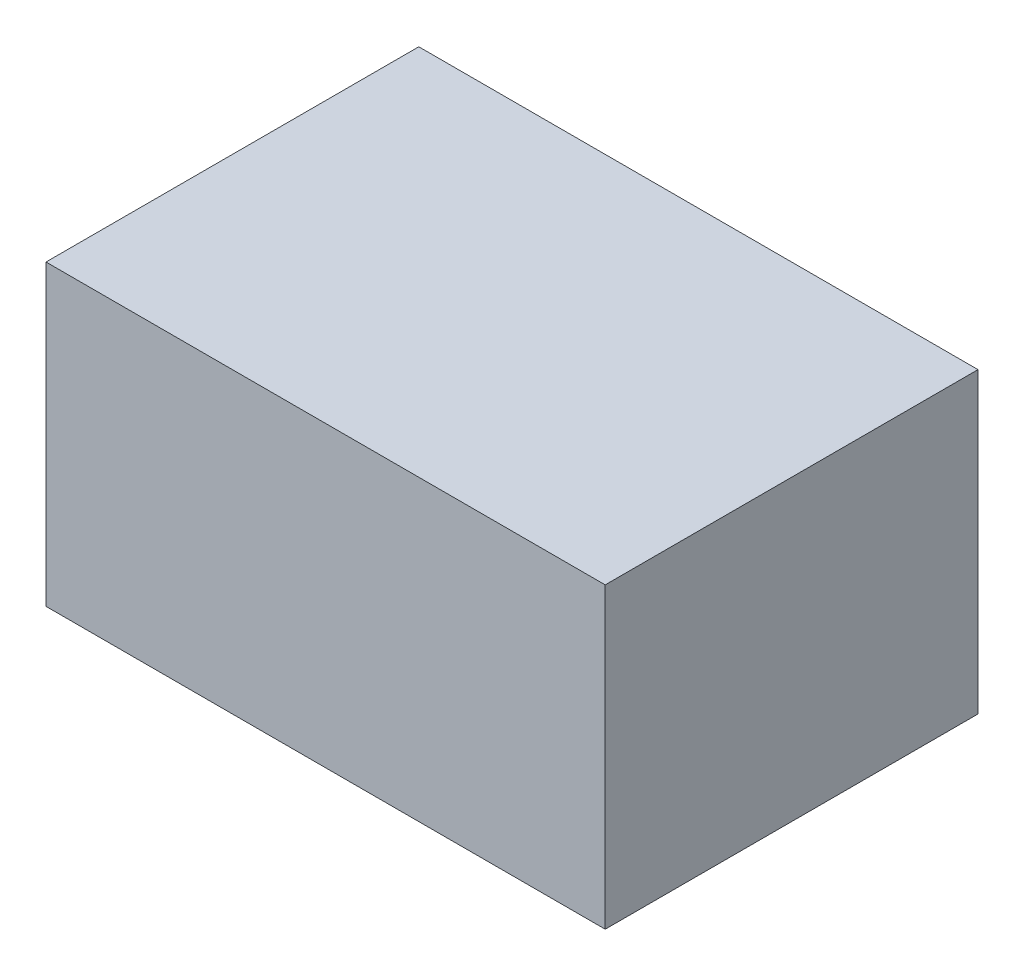
ISO-10303-21;
HEADER;
FILE_DESCRIPTION(('STEP AP214'),'2;1');
FILE_NAME('part.step','',(''),(''),'','','');
FILE_SCHEMA(('AUTOMOTIVE_DESIGN { 1 0 10303 214 1 1 1 1 }'));
ENDSEC;
DATA;
#1=APPLICATION_CONTEXT('core data for automotive mechanical design processes');
#2=APPLICATION_PROTOCOL_DEFINITION('international standard','automotive_design',2000,#1);
#3=PRODUCT_CONTEXT('',#1,'mechanical');
#4=PRODUCT('Part','Part','',(#3));
#5=PRODUCT_RELATED_PRODUCT_CATEGORY('part','',(#4));
#6=PRODUCT_DEFINITION_FORMATION('','',#4);
#7=PRODUCT_DEFINITION_CONTEXT('part definition',#1,'design');
#8=PRODUCT_DEFINITION('design','',#6,#7);
#9=PRODUCT_DEFINITION_SHAPE('','',#8);
#10=(LENGTH_UNIT() NAMED_UNIT(*) SI_UNIT(.MILLI.,.METRE.));
#11=(NAMED_UNIT(*) PLANE_ANGLE_UNIT() SI_UNIT($,.RADIAN.));
#12=(NAMED_UNIT(*) SI_UNIT($,.STERADIAN.) SOLID_ANGLE_UNIT());
#13=UNCERTAINTY_MEASURE_WITH_UNIT(LENGTH_MEASURE(1.E-05),#10,'distance_accuracy_value','');
#14=(GEOMETRIC_REPRESENTATION_CONTEXT(3) GLOBAL_UNCERTAINTY_ASSIGNED_CONTEXT((#13)) GLOBAL_UNIT_ASSIGNED_CONTEXT((#10,
#11,#12)) REPRESENTATION_CONTEXT('',''));
#15=CARTESIAN_POINT('',(0.,0.,0.));
#16=DIRECTION('',(0.,0.,1.));
#17=DIRECTION('',(1.,0.,0.));
#18=AXIS2_PLACEMENT_3D('',#15,#16,#17);
#19=CARTESIAN_POINT('',(-75.,80.,-50.));
#20=DIRECTION('',(1.,0.,0.));
#21=DIRECTION('',(0.,0.,-1.));
#22=AXIS2_PLACEMENT_3D('',#19,#20,#21);
#23=PLANE('',#22);
#24=DIRECTION('',(0.,0.,1.));
#25=VECTOR('',#24,1.);
#26=CARTESIAN_POINT('',(-75.,0.,-50.));
#27=LINE('',#26,#25);
#28=CARTESIAN_POINT('',(-75.,0.,-50.));
#29=VERTEX_POINT('',#28);
#30=CARTESIAN_POINT('',(-75.,0.,50.));
#31=VERTEX_POINT('',#30);
#32=EDGE_CURVE('E98',#29,#31,#27,.T.);
#33=ORIENTED_EDGE('',*,*,#32,.T.);
#34=DIRECTION('',(0.,-1.,0.));
#35=VECTOR('',#34,1.);
#36=CARTESIAN_POINT('',(-75.,80.,50.));
#37=LINE('',#36,#35);
#38=CARTESIAN_POINT('',(-75.,80.,50.));
#39=VERTEX_POINT('',#38);
#40=EDGE_CURVE('E11',#39,#31,#37,.T.);
#41=ORIENTED_EDGE('',*,*,#40,.F.);
#42=DIRECTION('',(0.,0.,1.));
#43=VECTOR('',#42,1.);
#44=CARTESIAN_POINT('',(-75.,80.,-50.));
#45=LINE('',#44,#43);
#46=CARTESIAN_POINT('',(-75.,80.,-50.));
#47=VERTEX_POINT('',#46);
#48=EDGE_CURVE('E86',#47,#39,#45,.T.);
#49=ORIENTED_EDGE('',*,*,#48,.F.);
#50=DIRECTION('',(0.,-1.,0.));
#51=VECTOR('',#50,1.);
#52=CARTESIAN_POINT('',(-75.,80.,-50.));
#53=LINE('',#52,#51);
#54=EDGE_CURVE('E94',#47,#29,#53,.T.);
#55=ORIENTED_EDGE('',*,*,#54,.T.);
#56=EDGE_LOOP('',(#33,#41,#49,#55));
#57=FACE_BOUND('',#56,.T.);
#58=ADVANCED_FACE('F35',(#57),#23,.F.);
#59=CARTESIAN_POINT('',(-75.,80.,50.));
#60=DIRECTION('',(0.,0.,-1.));
#61=DIRECTION('',(-1.,0.,0.));
#62=AXIS2_PLACEMENT_3D('',#59,#60,#61);
#63=PLANE('',#62);
#64=DIRECTION('',(1.,0.,0.));
#65=VECTOR('',#64,1.);
#66=CARTESIAN_POINT('',(-75.,0.,50.));
#67=LINE('',#66,#65);
#68=CARTESIAN_POINT('',(75.,0.,50.));
#69=VERTEX_POINT('',#68);
#70=EDGE_CURVE('E90',#31,#69,#67,.T.);
#71=ORIENTED_EDGE('',*,*,#70,.T.);
#72=DIRECTION('',(0.,-1.,0.));
#73=VECTOR('',#72,1.);
#74=CARTESIAN_POINT('',(75.,80.,50.));
#75=LINE('',#74,#73);
#76=CARTESIAN_POINT('',(75.,80.,50.));
#77=VERTEX_POINT('',#76);
#78=EDGE_CURVE('E43',#77,#69,#75,.T.);
#79=ORIENTED_EDGE('',*,*,#78,.F.);
#80=DIRECTION('',(1.,0.,0.));
#81=VECTOR('',#80,1.);
#82=CARTESIAN_POINT('',(-75.,80.,50.));
#83=LINE('',#82,#81);
#84=EDGE_CURVE('E81',#39,#77,#83,.T.);
#85=ORIENTED_EDGE('',*,*,#84,.F.);
#86=ORIENTED_EDGE('',*,*,#40,.T.);
#87=EDGE_LOOP('',(#71,#79,#85,#86));
#88=FACE_BOUND('',#87,.T.);
#89=ADVANCED_FACE('F89',(#88),#63,.F.);
#90=CARTESIAN_POINT('',(75.,80.,-50.));
#91=DIRECTION('',(-1.,0.,0.));
#92=DIRECTION('',(0.,0.,1.));
#93=AXIS2_PLACEMENT_3D('',#90,#91,#92);
#94=PLANE('',#93);
#95=DIRECTION('',(0.,0.,-1.));
#96=VECTOR('',#95,1.);
#97=CARTESIAN_POINT('',(75.,0.,-50.));
#98=LINE('',#97,#96);
#99=CARTESIAN_POINT('',(75.,0.,-50.));
#100=VERTEX_POINT('',#99);
#101=EDGE_CURVE('E68',#69,#100,#98,.T.);
#102=ORIENTED_EDGE('',*,*,#101,.T.);
#103=DIRECTION('',(0.,-1.,0.));
#104=VECTOR('',#103,1.);
#105=CARTESIAN_POINT('',(75.,80.,-50.));
#106=LINE('',#105,#104);
#107=CARTESIAN_POINT('',(75.,80.,-50.));
#108=VERTEX_POINT('',#107);
#109=EDGE_CURVE('E91',#108,#100,#106,.T.);
#110=ORIENTED_EDGE('',*,*,#109,.F.);
#111=DIRECTION('',(0.,0.,-1.));
#112=VECTOR('',#111,1.);
#113=CARTESIAN_POINT('',(75.,80.,-50.));
#114=LINE('',#113,#112);
#115=EDGE_CURVE('E84',#77,#108,#114,.T.);
#116=ORIENTED_EDGE('',*,*,#115,.F.);
#117=ORIENTED_EDGE('',*,*,#78,.T.);
#118=EDGE_LOOP('',(#102,#110,#116,#117));
#119=FACE_BOUND('',#118,.T.);
#120=ADVANCED_FACE('F92',(#119),#94,.F.);
#121=CARTESIAN_POINT('',(-75.,80.,-50.));
#122=DIRECTION('',(0.,0.,1.));
#123=DIRECTION('',(1.,0.,0.));
#124=AXIS2_PLACEMENT_3D('',#121,#122,#123);
#125=PLANE('',#124);
#126=DIRECTION('',(-1.,0.,0.));
#127=VECTOR('',#126,1.);
#128=CARTESIAN_POINT('',(-75.,0.,-50.));
#129=LINE('',#128,#127);
#130=EDGE_CURVE('E74',#100,#29,#129,.T.);
#131=ORIENTED_EDGE('',*,*,#130,.T.);
#132=ORIENTED_EDGE('',*,*,#54,.F.);
#133=DIRECTION('',(-1.,0.,0.));
#134=VECTOR('',#133,1.);
#135=CARTESIAN_POINT('',(-75.,80.,-50.));
#136=LINE('',#135,#134);
#137=EDGE_CURVE('E51',#108,#47,#136,.T.);
#138=ORIENTED_EDGE('',*,*,#137,.F.);
#139=ORIENTED_EDGE('',*,*,#109,.T.);
#140=EDGE_LOOP('',(#131,#132,#138,#139));
#141=FACE_BOUND('',#140,.T.);
#142=ADVANCED_FACE('F105',(#141),#125,.F.);
#143=CARTESIAN_POINT('',(0.,80.,0.));
#144=DIRECTION('',(0.,1.,0.));
#145=DIRECTION('',(0.,0.,1.));
#146=AXIS2_PLACEMENT_3D('',#143,#144,#145);
#147=PLANE('',#146);
#148=ORIENTED_EDGE('',*,*,#48,.T.);
#149=ORIENTED_EDGE('',*,*,#84,.T.);
#150=ORIENTED_EDGE('',*,*,#115,.T.);
#151=ORIENTED_EDGE('',*,*,#137,.T.);
#152=EDGE_LOOP('',(#148,#149,#150,#151));
#153=FACE_BOUND('',#152,.T.);
#154=ADVANCED_FACE('F82',(#153),#147,.T.);
#155=CARTESIAN_POINT('',(0.,0.,0.));
#156=DIRECTION('',(0.,1.,0.));
#157=DIRECTION('',(0.,0.,1.));
#158=AXIS2_PLACEMENT_3D('',#155,#156,#157);
#159=PLANE('',#158);
#160=ORIENTED_EDGE('',*,*,#32,.F.);
#161=ORIENTED_EDGE('',*,*,#130,.F.);
#162=ORIENTED_EDGE('',*,*,#101,.F.);
#163=ORIENTED_EDGE('',*,*,#70,.F.);
#164=EDGE_LOOP('',(#160,#161,#162,#163));
#165=FACE_BOUND('',#164,.T.);
#166=ADVANCED_FACE('F108',(#165),#159,.F.);
#167=CLOSED_SHELL('',(#58,#89,#120,#142,#154,#166));
#168=MANIFOLD_SOLID_BREP('B2',#167);
#169=ADVANCED_BREP_SHAPE_REPRESENTATION('',(#18,#168),#14);
#170=SHAPE_DEFINITION_REPRESENTATION(#9,#169);
ENDSEC;
END-ISO-10303-21;
